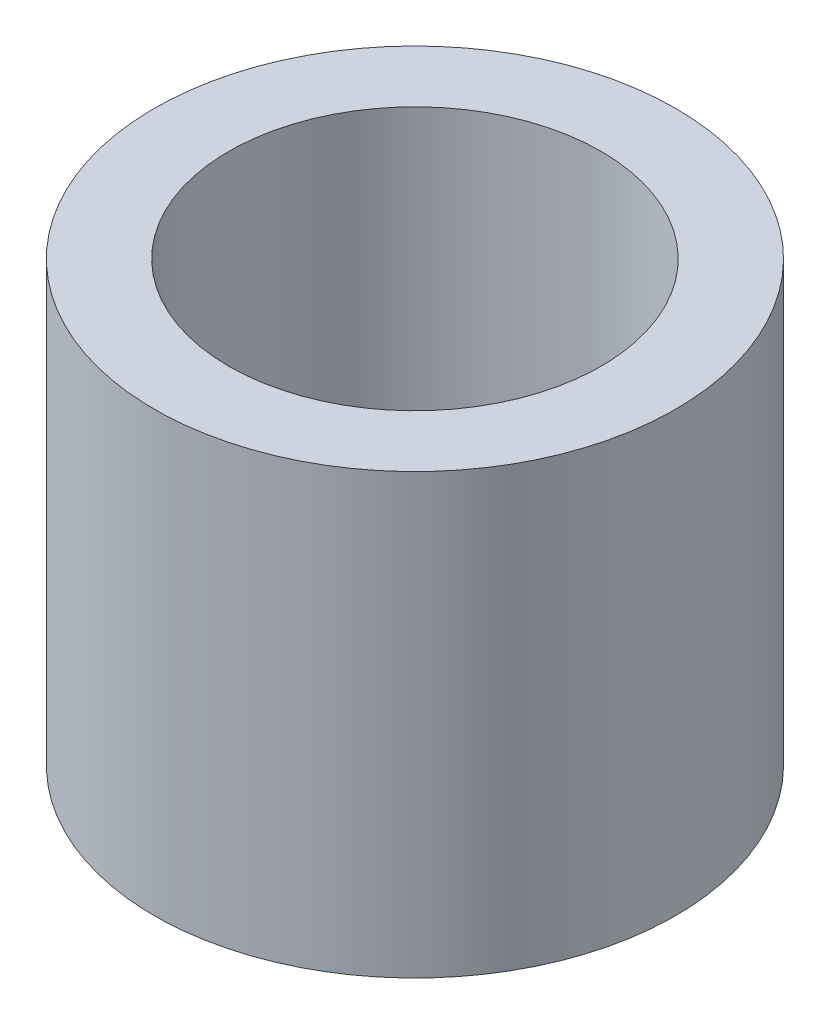
ISO-10303-21;
HEADER;
FILE_DESCRIPTION(('STEP AP214'),'2;1');
FILE_NAME('part.step','',(''),(''),'','','');
FILE_SCHEMA(('AUTOMOTIVE_DESIGN { 1 0 10303 214 1 1 1 1 }'));
ENDSEC;
DATA;
#1=APPLICATION_CONTEXT('core data for automotive mechanical design processes');
#2=APPLICATION_PROTOCOL_DEFINITION('international standard','automotive_design',2000,#1);
#3=PRODUCT_CONTEXT('',#1,'mechanical');
#4=PRODUCT('Part','Part','',(#3));
#5=PRODUCT_RELATED_PRODUCT_CATEGORY('part','',(#4));
#6=PRODUCT_DEFINITION_FORMATION('','',#4);
#7=PRODUCT_DEFINITION_CONTEXT('part definition',#1,'design');
#8=PRODUCT_DEFINITION('design','',#6,#7);
#9=PRODUCT_DEFINITION_SHAPE('','',#8);
#10=(LENGTH_UNIT() NAMED_UNIT(*) SI_UNIT(.MILLI.,.METRE.));
#11=(NAMED_UNIT(*) PLANE_ANGLE_UNIT() SI_UNIT($,.RADIAN.));
#12=(NAMED_UNIT(*) SI_UNIT($,.STERADIAN.) SOLID_ANGLE_UNIT());
#13=UNCERTAINTY_MEASURE_WITH_UNIT(LENGTH_MEASURE(1.E-05),#10,'distance_accuracy_value','');
#14=(GEOMETRIC_REPRESENTATION_CONTEXT(3) GLOBAL_UNCERTAINTY_ASSIGNED_CONTEXT((#13)) GLOBAL_UNIT_ASSIGNED_CONTEXT((#10,
#11,#12)) REPRESENTATION_CONTEXT('',''));
#15=CARTESIAN_POINT('',(0.,0.,0.));
#16=DIRECTION('',(0.,0.,1.));
#17=DIRECTION('',(1.,0.,0.));
#18=AXIS2_PLACEMENT_3D('',#15,#16,#17);
#19=CARTESIAN_POINT('',(0.,5.89026,0.));
#20=DIRECTION('',(0.,1.,0.));
#21=DIRECTION('',(0.,0.,1.));
#22=AXIS2_PLACEMENT_3D('',#19,#20,#21);
#23=PLANE('',#22);
#24=CARTESIAN_POINT('',(0.,5.89026,0.));
#25=DIRECTION('',(0.,1.,0.));
#26=DIRECTION('',(0.,0.,1.));
#27=AXIS2_PLACEMENT_3D('',#24,#25,#26);
#28=CIRCLE('',#27,3.5);
#29=CARTESIAN_POINT('',(0.,5.89026,-3.5));
#30=VERTEX_POINT('',#29);
#31=EDGE_CURVE('E10',#30,#30,#28,.T.);
#32=ORIENTED_EDGE('',*,*,#31,.T.);
#33=EDGE_LOOP('',(#32));
#34=FACE_BOUND('',#33,.T.);
#35=CARTESIAN_POINT('',(0.,5.89026,0.));
#36=DIRECTION('',(0.,1.,0.));
#37=DIRECTION('',(0.,0.,1.));
#38=AXIS2_PLACEMENT_3D('',#35,#36,#37);
#39=CIRCLE('',#38,2.5);
#40=CARTESIAN_POINT('',(0.,5.89026,-2.5));
#41=VERTEX_POINT('',#40);
#42=EDGE_CURVE('E42',#41,#41,#39,.T.);
#43=ORIENTED_EDGE('',*,*,#42,.F.);
#44=EDGE_LOOP('',(#43));
#45=FACE_BOUND('',#44,.T.);
#46=ADVANCED_FACE('F31',(#34,#45),#23,.T.);
#47=CARTESIAN_POINT('',(0.,0.,0.));
#48=DIRECTION('',(0.,1.,0.));
#49=DIRECTION('',(0.,0.,1.));
#50=AXIS2_PLACEMENT_3D('',#47,#48,#49);
#51=PLANE('',#50);
#52=CARTESIAN_POINT('',(0.,0.,0.));
#53=DIRECTION('',(0.,1.,0.));
#54=DIRECTION('',(0.,0.,1.));
#55=AXIS2_PLACEMENT_3D('',#52,#53,#54);
#56=CIRCLE('',#55,3.5);
#57=CARTESIAN_POINT('',(0.,0.,-3.5));
#58=VERTEX_POINT('',#57);
#59=EDGE_CURVE('E35',#58,#58,#56,.T.);
#60=ORIENTED_EDGE('',*,*,#59,.F.);
#61=EDGE_LOOP('',(#60));
#62=FACE_BOUND('',#61,.T.);
#63=CARTESIAN_POINT('',(0.,0.,0.));
#64=DIRECTION('',(0.,1.,0.));
#65=DIRECTION('',(0.,0.,1.));
#66=AXIS2_PLACEMENT_3D('',#63,#64,#65);
#67=CIRCLE('',#66,2.5);
#68=CARTESIAN_POINT('',(0.,0.,-2.5));
#69=VERTEX_POINT('',#68);
#70=EDGE_CURVE('E44',#69,#69,#67,.T.);
#71=ORIENTED_EDGE('',*,*,#70,.T.);
#72=EDGE_LOOP('',(#71));
#73=FACE_BOUND('',#72,.T.);
#74=ADVANCED_FACE('F54',(#62,#73),#51,.F.);
#75=CARTESIAN_POINT('',(0.,5.89026,0.));
#76=DIRECTION('',(0.,-1.,0.));
#77=DIRECTION('',(0.,0.,-1.));
#78=AXIS2_PLACEMENT_3D('',#75,#76,#77);
#79=CYLINDRICAL_SURFACE('',#78,3.5);
#80=CARTESIAN_POINT('',(0.,5.89026,-3.5));
#81=CARTESIAN_POINT('',(0.,5.828903125,-3.5));
#82=CARTESIAN_POINT('',(0.,5.76754625,-3.5));
#83=CARTESIAN_POINT('',(0.,5.6448325,-3.5));
#84=CARTESIAN_POINT('',(0.,5.583475625,-3.5));
#85=CARTESIAN_POINT('',(0.,5.460761875,-3.5));
#86=CARTESIAN_POINT('',(0.,5.399405,-3.5));
#87=CARTESIAN_POINT('',(0.,5.27669125,-3.5));
#88=CARTESIAN_POINT('',(0.,5.215334375,-3.5));
#89=CARTESIAN_POINT('',(0.,5.092620625,-3.5));
#90=CARTESIAN_POINT('',(0.,5.03126375,-3.5));
#91=CARTESIAN_POINT('',(0.,4.90855,-3.5));
#92=CARTESIAN_POINT('',(0.,4.847193125,-3.5));
#93=CARTESIAN_POINT('',(0.,4.724479375,-3.5));
#94=CARTESIAN_POINT('',(0.,4.6631225,-3.5));
#95=CARTESIAN_POINT('',(0.,4.54040875,-3.5));
#96=CARTESIAN_POINT('',(0.,4.479051875,-3.5));
#97=CARTESIAN_POINT('',(0.,4.356338125,-3.5));
#98=CARTESIAN_POINT('',(0.,4.29498125,-3.5));
#99=CARTESIAN_POINT('',(0.,4.1722675,-3.5));
#100=CARTESIAN_POINT('',(0.,4.110910625,-3.5));
#101=CARTESIAN_POINT('',(0.,3.988196875,-3.5));
#102=CARTESIAN_POINT('',(0.,3.92684,-3.5));
#103=CARTESIAN_POINT('',(0.,3.80412625,-3.5));
#104=CARTESIAN_POINT('',(0.,3.742769375,-3.5));
#105=CARTESIAN_POINT('',(0.,3.620055625,-3.5));
#106=CARTESIAN_POINT('',(0.,3.55869875,-3.5));
#107=CARTESIAN_POINT('',(0.,3.435985,-3.5));
#108=CARTESIAN_POINT('',(0.,3.374628125,-3.5));
#109=CARTESIAN_POINT('',(0.,3.251914375,-3.5));
#110=CARTESIAN_POINT('',(0.,3.1905575,-3.5));
#111=CARTESIAN_POINT('',(0.,3.06784375,-3.5));
#112=CARTESIAN_POINT('',(0.,3.006486875,-3.5));
#113=CARTESIAN_POINT('',(0.,2.883773125,-3.5));
#114=CARTESIAN_POINT('',(0.,2.82241625,-3.5));
#115=CARTESIAN_POINT('',(0.,2.6997025,-3.5));
#116=CARTESIAN_POINT('',(0.,2.638345625,-3.5));
#117=CARTESIAN_POINT('',(0.,2.515631875,-3.5));
#118=CARTESIAN_POINT('',(0.,2.454275,-3.5));
#119=CARTESIAN_POINT('',(0.,2.33156125,-3.5));
#120=CARTESIAN_POINT('',(0.,2.270204375,-3.5));
#121=CARTESIAN_POINT('',(0.,2.147490625,-3.5));
#122=CARTESIAN_POINT('',(0.,2.08613375,-3.5));
#123=CARTESIAN_POINT('',(0.,1.96342,-3.5));
#124=CARTESIAN_POINT('',(0.,1.902063125,-3.5));
#125=CARTESIAN_POINT('',(0.,1.779349375,-3.5));
#126=CARTESIAN_POINT('',(0.,1.7179925,-3.5));
#127=CARTESIAN_POINT('',(0.,1.59527875,-3.5));
#128=CARTESIAN_POINT('',(0.,1.533921875,-3.5));
#129=CARTESIAN_POINT('',(0.,1.411208125,-3.5));
#130=CARTESIAN_POINT('',(0.,1.34985125,-3.5));
#131=CARTESIAN_POINT('',(0.,1.2271375,-3.5));
#132=CARTESIAN_POINT('',(0.,1.165780625,-3.5));
#133=CARTESIAN_POINT('',(0.,1.043066875,-3.5));
#134=CARTESIAN_POINT('',(0.,0.981709999999999,-3.5));
#135=CARTESIAN_POINT('',(0.,0.858996249999999,-3.5));
#136=CARTESIAN_POINT('',(0.,0.797639374999999,-3.5));
#137=CARTESIAN_POINT('',(0.,0.674925624999999,-3.5));
#138=CARTESIAN_POINT('',(0.,0.613568749999999,-3.5));
#139=CARTESIAN_POINT('',(0.,0.490854999999999,-3.5));
#140=CARTESIAN_POINT('',(0.,0.429498124999999,-3.5));
#141=CARTESIAN_POINT('',(0.,0.306784375,-3.5));
#142=CARTESIAN_POINT('',(0.,0.245427499999999,-3.5));
#143=CARTESIAN_POINT('',(0.,0.122713749999999,-3.5));
#144=CARTESIAN_POINT('',(0.,0.0613568749999993,-3.5));
#145=CARTESIAN_POINT('',(0.,0.,-3.5));
#146=B_SPLINE_CURVE_WITH_KNOTS('',3,(#80,#81,#82,#83,#84,#85,#86,#87,#88,#89,#90,#91,#92,#93,
#94,#95,#96,#97,#98,#99,#100,#101,#102,#103,#104,#105,#106,#107,#108,#109,#110,#111,#112,#113,
#114,#115,#116,#117,#118,#119,#120,#121,#122,#123,#124,#125,#126,#127,#128,#129,#130,#131,#132,
#133,#134,#135,#136,#137,#138,#139,#140,#141,#142,#143,#144,#145),.UNSPECIFIED.,.F.,.F.,(4,2,2,
2,2,2,2,2,2,2,2,2,2,2,2,2,2,2,2,2,2,2,2,2,2,2,2,2,2,2,2,2,4),(0.,0.184070625,0.368141250000001,
0.552211875000001,0.7362825,0.920353125,1.10442375,1.288494375,1.472565,1.656635625,1.84070625,
2.024776875,2.2088475,2.392918125,2.57698875,2.761059375,2.94513,3.129200625,3.31327125,
3.497341875,3.6814125,3.865483125,4.04955375,4.233624375,4.417695,4.601765625,4.78583625,
4.969906875,5.1539775,5.338048125,5.52211875,5.706189375,5.89026),.UNSPECIFIED.);
#147=EDGE_CURVE('BSEAM33',#30,#58,#146,.T.);
#148=ORIENTED_EDGE('',*,*,#31,.F.);
#149=ORIENTED_EDGE('',*,*,#59,.T.);
#150=ORIENTED_EDGE('',*,*,#147,.T.);
#151=ORIENTED_EDGE('',*,*,#147,.F.);
#152=EDGE_LOOP('',(#148,#150,#149,#151));
#153=FACE_BOUND('',#152,.T.);
#154=ADVANCED_FACE('F33',(#153),#79,.T.);
#155=CARTESIAN_POINT('',(0.,5.89026,0.));
#156=DIRECTION('',(0.,-1.,0.));
#157=DIRECTION('',(0.,0.,-1.));
#158=AXIS2_PLACEMENT_3D('',#155,#156,#157);
#159=CYLINDRICAL_SURFACE('',#158,2.5);
#160=CARTESIAN_POINT('',(0.,5.89026,-2.5));
#161=CARTESIAN_POINT('',(0.,5.828903125,-2.5));
#162=CARTESIAN_POINT('',(0.,5.76754625,-2.5));
#163=CARTESIAN_POINT('',(0.,5.6448325,-2.5));
#164=CARTESIAN_POINT('',(0.,5.583475625,-2.5));
#165=CARTESIAN_POINT('',(0.,5.460761875,-2.5));
#166=CARTESIAN_POINT('',(0.,5.399405,-2.5));
#167=CARTESIAN_POINT('',(0.,5.27669125,-2.5));
#168=CARTESIAN_POINT('',(0.,5.215334375,-2.5));
#169=CARTESIAN_POINT('',(0.,5.092620625,-2.5));
#170=CARTESIAN_POINT('',(0.,5.03126375,-2.5));
#171=CARTESIAN_POINT('',(0.,4.90855,-2.5));
#172=CARTESIAN_POINT('',(0.,4.847193125,-2.5));
#173=CARTESIAN_POINT('',(0.,4.724479375,-2.5));
#174=CARTESIAN_POINT('',(0.,4.6631225,-2.5));
#175=CARTESIAN_POINT('',(0.,4.54040875,-2.5));
#176=CARTESIAN_POINT('',(0.,4.479051875,-2.5));
#177=CARTESIAN_POINT('',(0.,4.356338125,-2.5));
#178=CARTESIAN_POINT('',(0.,4.29498125,-2.5));
#179=CARTESIAN_POINT('',(0.,4.1722675,-2.5));
#180=CARTESIAN_POINT('',(0.,4.110910625,-2.5));
#181=CARTESIAN_POINT('',(0.,3.988196875,-2.5));
#182=CARTESIAN_POINT('',(0.,3.92684,-2.5));
#183=CARTESIAN_POINT('',(0.,3.80412625,-2.5));
#184=CARTESIAN_POINT('',(0.,3.742769375,-2.5));
#185=CARTESIAN_POINT('',(0.,3.620055625,-2.5));
#186=CARTESIAN_POINT('',(0.,3.55869875,-2.5));
#187=CARTESIAN_POINT('',(0.,3.435985,-2.5));
#188=CARTESIAN_POINT('',(0.,3.374628125,-2.5));
#189=CARTESIAN_POINT('',(0.,3.251914375,-2.5));
#190=CARTESIAN_POINT('',(0.,3.1905575,-2.5));
#191=CARTESIAN_POINT('',(0.,3.06784375,-2.5));
#192=CARTESIAN_POINT('',(0.,3.006486875,-2.5));
#193=CARTESIAN_POINT('',(0.,2.883773125,-2.5));
#194=CARTESIAN_POINT('',(0.,2.82241625,-2.5));
#195=CARTESIAN_POINT('',(0.,2.6997025,-2.5));
#196=CARTESIAN_POINT('',(0.,2.638345625,-2.5));
#197=CARTESIAN_POINT('',(0.,2.515631875,-2.5));
#198=CARTESIAN_POINT('',(0.,2.454275,-2.5));
#199=CARTESIAN_POINT('',(0.,2.33156125,-2.5));
#200=CARTESIAN_POINT('',(0.,2.270204375,-2.5));
#201=CARTESIAN_POINT('',(0.,2.147490625,-2.5));
#202=CARTESIAN_POINT('',(0.,2.08613375,-2.5));
#203=CARTESIAN_POINT('',(0.,1.96342,-2.5));
#204=CARTESIAN_POINT('',(0.,1.902063125,-2.5));
#205=CARTESIAN_POINT('',(0.,1.779349375,-2.5));
#206=CARTESIAN_POINT('',(0.,1.7179925,-2.5));
#207=CARTESIAN_POINT('',(0.,1.59527875,-2.5));
#208=CARTESIAN_POINT('',(0.,1.533921875,-2.5));
#209=CARTESIAN_POINT('',(0.,1.411208125,-2.5));
#210=CARTESIAN_POINT('',(0.,1.34985125,-2.5));
#211=CARTESIAN_POINT('',(0.,1.2271375,-2.5));
#212=CARTESIAN_POINT('',(0.,1.165780625,-2.5));
#213=CARTESIAN_POINT('',(0.,1.043066875,-2.5));
#214=CARTESIAN_POINT('',(0.,0.981709999999999,-2.5));
#215=CARTESIAN_POINT('',(0.,0.858996249999999,-2.5));
#216=CARTESIAN_POINT('',(0.,0.797639374999999,-2.5));
#217=CARTESIAN_POINT('',(0.,0.674925624999999,-2.5));
#218=CARTESIAN_POINT('',(0.,0.613568749999999,-2.5));
#219=CARTESIAN_POINT('',(0.,0.490854999999999,-2.5));
#220=CARTESIAN_POINT('',(0.,0.429498124999999,-2.5));
#221=CARTESIAN_POINT('',(0.,0.306784374999999,-2.5));
#222=CARTESIAN_POINT('',(0.,0.245427499999999,-2.5));
#223=CARTESIAN_POINT('',(0.,0.122713749999999,-2.5));
#224=CARTESIAN_POINT('',(0.,0.0613568749999993,-2.5));
#225=CARTESIAN_POINT('',(0.,0.,-2.5));
#226=B_SPLINE_CURVE_WITH_KNOTS('',3,(#160,#161,#162,#163,#164,#165,#166,#167,#168,#169,#170,
#171,#172,#173,#174,#175,#176,#177,#178,#179,#180,#181,#182,#183,#184,#185,#186,#187,#188,#189,
#190,#191,#192,#193,#194,#195,#196,#197,#198,#199,#200,#201,#202,#203,#204,#205,#206,#207,#208,
#209,#210,#211,#212,#213,#214,#215,#216,#217,#218,#219,#220,#221,#222,#223,#224,#225),
.UNSPECIFIED.,.F.,.F.,(4,2,2,2,2,2,2,2,2,2,2,2,2,2,2,2,2,2,2,2,2,2,2,2,2,2,2,2,2,2,2,2,4),(0.,
0.184070624999999,0.36814125,0.552211874999999,0.736282499999999,0.920353125,1.10442375,
1.288494375,1.472565,1.656635625,1.84070625,2.024776875,2.2088475,2.392918125,2.57698875,
2.761059375,2.94513,3.129200625,3.31327125,3.497341875,3.6814125,3.865483125,4.04955375,
4.233624375,4.417695,4.601765625,4.78583625,4.969906875,5.1539775,5.338048125,5.52211875,
5.706189375,5.89026),.UNSPECIFIED.);
#227=EDGE_CURVE('BSEAM50',#41,#69,#226,.T.);
#228=ORIENTED_EDGE('',*,*,#42,.T.);
#229=ORIENTED_EDGE('',*,*,#70,.F.);
#230=ORIENTED_EDGE('',*,*,#227,.T.);
#231=ORIENTED_EDGE('',*,*,#227,.F.);
#232=EDGE_LOOP('',(#228,#230,#229,#231));
#233=FACE_BOUND('',#232,.T.);
#234=ADVANCED_FACE('F50',(#233),#159,.F.);
#235=CLOSED_SHELL('',(#46,#74,#154,#234));
#236=MANIFOLD_SOLID_BREP('B2',#235);
#237=ADVANCED_BREP_SHAPE_REPRESENTATION('',(#18,#236),#14);
#238=SHAPE_DEFINITION_REPRESENTATION(#9,#237);
ENDSEC;
END-ISO-10303-21;
